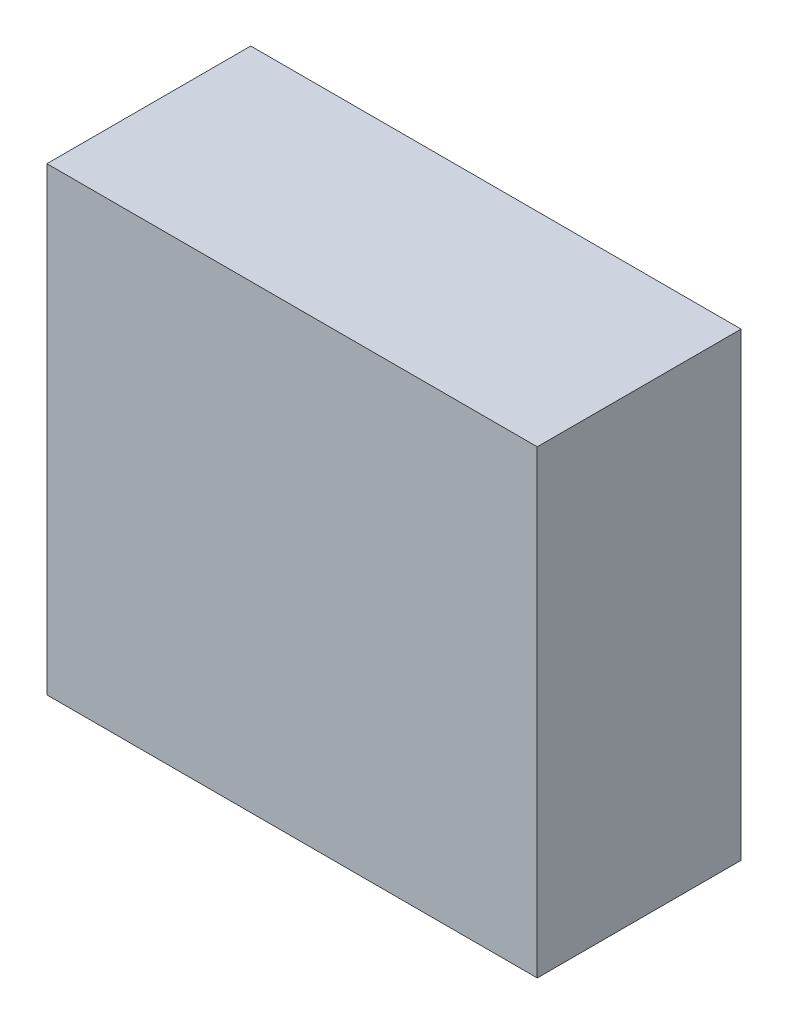
ISO-10303-21;
HEADER;
FILE_DESCRIPTION(('STEP AP214'),'2;1');
FILE_NAME('part.step','',(''),(''),'','','');
FILE_SCHEMA(('AUTOMOTIVE_DESIGN { 1 0 10303 214 1 1 1 1 }'));
ENDSEC;
DATA;
#1=APPLICATION_CONTEXT('core data for automotive mechanical design processes');
#2=APPLICATION_PROTOCOL_DEFINITION('international standard','automotive_design',2000,#1);
#3=PRODUCT_CONTEXT('',#1,'mechanical');
#4=PRODUCT('Part','Part','',(#3));
#5=PRODUCT_RELATED_PRODUCT_CATEGORY('part','',(#4));
#6=PRODUCT_DEFINITION_FORMATION('','',#4);
#7=PRODUCT_DEFINITION_CONTEXT('part definition',#1,'design');
#8=PRODUCT_DEFINITION('design','',#6,#7);
#9=PRODUCT_DEFINITION_SHAPE('','',#8);
#10=(LENGTH_UNIT() NAMED_UNIT(*) SI_UNIT(.MILLI.,.METRE.));
#11=(NAMED_UNIT(*) PLANE_ANGLE_UNIT() SI_UNIT($,.RADIAN.));
#12=(NAMED_UNIT(*) SI_UNIT($,.STERADIAN.) SOLID_ANGLE_UNIT());
#13=UNCERTAINTY_MEASURE_WITH_UNIT(LENGTH_MEASURE(1.E-05),#10,'distance_accuracy_value','');
#14=(GEOMETRIC_REPRESENTATION_CONTEXT(3) GLOBAL_UNCERTAINTY_ASSIGNED_CONTEXT((#13)) GLOBAL_UNIT_ASSIGNED_CONTEXT((#10,
#11,#12)) REPRESENTATION_CONTEXT('',''));
#15=CARTESIAN_POINT('',(0.,0.,0.));
#16=DIRECTION('',(0.,0.,1.));
#17=DIRECTION('',(1.,0.,0.));
#18=AXIS2_PLACEMENT_3D('',#15,#16,#17);
#19=CARTESIAN_POINT('',(0.,0.,74.));
#20=DIRECTION('',(1.,0.,0.));
#21=DIRECTION('',(0.,0.,-1.));
#22=AXIS2_PLACEMENT_3D('',#19,#20,#21);
#23=PLANE('',#22);
#24=DIRECTION('',(0.,-1.,0.));
#25=VECTOR('',#24,1.);
#26=CARTESIAN_POINT('',(0.,0.,0.));
#27=LINE('',#26,#25);
#28=CARTESIAN_POINT('',(0.,167.,0.));
#29=VERTEX_POINT('',#28);
#30=CARTESIAN_POINT('',(0.,0.,0.));
#31=VERTEX_POINT('',#30);
#32=EDGE_CURVE('E102',#29,#31,#27,.T.);
#33=ORIENTED_EDGE('',*,*,#32,.T.);
#34=DIRECTION('',(0.,0.,-1.));
#35=VECTOR('',#34,1.);
#36=CARTESIAN_POINT('',(0.,0.,74.));
#37=LINE('',#36,#35);
#38=CARTESIAN_POINT('',(0.,0.,74.));
#39=VERTEX_POINT('',#38);
#40=EDGE_CURVE('E11',#39,#31,#37,.T.);
#41=ORIENTED_EDGE('',*,*,#40,.F.);
#42=DIRECTION('',(0.,-1.,0.));
#43=VECTOR('',#42,1.);
#44=CARTESIAN_POINT('',(0.,0.,74.));
#45=LINE('',#44,#43);
#46=CARTESIAN_POINT('',(0.,167.,74.));
#47=VERTEX_POINT('',#46);
#48=EDGE_CURVE('E90',#47,#39,#45,.T.);
#49=ORIENTED_EDGE('',*,*,#48,.F.);
#50=DIRECTION('',(0.,0.,-1.));
#51=VECTOR('',#50,1.);
#52=CARTESIAN_POINT('',(0.,167.,74.));
#53=LINE('',#52,#51);
#54=EDGE_CURVE('E98',#47,#29,#53,.T.);
#55=ORIENTED_EDGE('',*,*,#54,.T.);
#56=EDGE_LOOP('',(#33,#41,#49,#55));
#57=FACE_BOUND('',#56,.T.);
#58=ADVANCED_FACE('F39',(#57),#23,.F.);
#59=CARTESIAN_POINT('',(0.,0.,74.));
#60=DIRECTION('',(0.,1.,0.));
#61=DIRECTION('',(0.,0.,1.));
#62=AXIS2_PLACEMENT_3D('',#59,#60,#61);
#63=PLANE('',#62);
#64=DIRECTION('',(1.,0.,0.));
#65=VECTOR('',#64,1.);
#66=CARTESIAN_POINT('',(0.,0.,0.));
#67=LINE('',#66,#65);
#68=CARTESIAN_POINT('',(178.,0.,0.));
#69=VERTEX_POINT('',#68);
#70=EDGE_CURVE('E94',#31,#69,#67,.T.);
#71=ORIENTED_EDGE('',*,*,#70,.T.);
#72=DIRECTION('',(0.,0.,-1.));
#73=VECTOR('',#72,1.);
#74=CARTESIAN_POINT('',(178.,0.,74.));
#75=LINE('',#74,#73);
#76=CARTESIAN_POINT('',(178.,0.,74.));
#77=VERTEX_POINT('',#76);
#78=EDGE_CURVE('E47',#77,#69,#75,.T.);
#79=ORIENTED_EDGE('',*,*,#78,.F.);
#80=DIRECTION('',(1.,0.,0.));
#81=VECTOR('',#80,1.);
#82=CARTESIAN_POINT('',(0.,0.,74.));
#83=LINE('',#82,#81);
#84=EDGE_CURVE('E85',#39,#77,#83,.T.);
#85=ORIENTED_EDGE('',*,*,#84,.F.);
#86=ORIENTED_EDGE('',*,*,#40,.T.);
#87=EDGE_LOOP('',(#71,#79,#85,#86));
#88=FACE_BOUND('',#87,.T.);
#89=ADVANCED_FACE('F93',(#88),#63,.F.);
#90=CARTESIAN_POINT('',(178.,0.,74.));
#91=DIRECTION('',(-1.,0.,0.));
#92=DIRECTION('',(0.,0.,1.));
#93=AXIS2_PLACEMENT_3D('',#90,#91,#92);
#94=PLANE('',#93);
#95=DIRECTION('',(0.,1.,0.));
#96=VECTOR('',#95,1.);
#97=CARTESIAN_POINT('',(178.,0.,0.));
#98=LINE('',#97,#96);
#99=CARTESIAN_POINT('',(178.,167.,0.));
#100=VERTEX_POINT('',#99);
#101=EDGE_CURVE('E72',#69,#100,#98,.T.);
#102=ORIENTED_EDGE('',*,*,#101,.T.);
#103=DIRECTION('',(0.,0.,-1.));
#104=VECTOR('',#103,1.);
#105=CARTESIAN_POINT('',(178.,167.,74.));
#106=LINE('',#105,#104);
#107=CARTESIAN_POINT('',(178.,167.,74.));
#108=VERTEX_POINT('',#107);
#109=EDGE_CURVE('E95',#108,#100,#106,.T.);
#110=ORIENTED_EDGE('',*,*,#109,.F.);
#111=DIRECTION('',(0.,1.,0.));
#112=VECTOR('',#111,1.);
#113=CARTESIAN_POINT('',(178.,0.,74.));
#114=LINE('',#113,#112);
#115=EDGE_CURVE('E88',#77,#108,#114,.T.);
#116=ORIENTED_EDGE('',*,*,#115,.F.);
#117=ORIENTED_EDGE('',*,*,#78,.T.);
#118=EDGE_LOOP('',(#102,#110,#116,#117));
#119=FACE_BOUND('',#118,.T.);
#120=ADVANCED_FACE('F96',(#119),#94,.F.);
#121=CARTESIAN_POINT('',(0.,167.,74.));
#122=DIRECTION('',(0.,-1.,0.));
#123=DIRECTION('',(0.,0.,-1.));
#124=AXIS2_PLACEMENT_3D('',#121,#122,#123);
#125=PLANE('',#124);
#126=DIRECTION('',(-1.,0.,0.));
#127=VECTOR('',#126,1.);
#128=CARTESIAN_POINT('',(0.,167.,0.));
#129=LINE('',#128,#127);
#130=EDGE_CURVE('E78',#100,#29,#129,.T.);
#131=ORIENTED_EDGE('',*,*,#130,.T.);
#132=ORIENTED_EDGE('',*,*,#54,.F.);
#133=DIRECTION('',(-1.,0.,0.));
#134=VECTOR('',#133,1.);
#135=CARTESIAN_POINT('',(0.,167.,74.));
#136=LINE('',#135,#134);
#137=EDGE_CURVE('E55',#108,#47,#136,.T.);
#138=ORIENTED_EDGE('',*,*,#137,.F.);
#139=ORIENTED_EDGE('',*,*,#109,.T.);
#140=EDGE_LOOP('',(#131,#132,#138,#139));
#141=FACE_BOUND('',#140,.T.);
#142=ADVANCED_FACE('F109',(#141),#125,.F.);
#143=CARTESIAN_POINT('',(0.,0.,74.));
#144=DIRECTION('',(0.,0.,-1.));
#145=DIRECTION('',(-1.,0.,0.));
#146=AXIS2_PLACEMENT_3D('',#143,#144,#145);
#147=PLANE('',#146);
#148=ORIENTED_EDGE('',*,*,#48,.T.);
#149=ORIENTED_EDGE('',*,*,#84,.T.);
#150=ORIENTED_EDGE('',*,*,#115,.T.);
#151=ORIENTED_EDGE('',*,*,#137,.T.);
#152=EDGE_LOOP('',(#148,#149,#150,#151));
#153=FACE_BOUND('',#152,.T.);
#154=ADVANCED_FACE('F86',(#153),#147,.F.);
#155=CARTESIAN_POINT('',(0.,0.,0.));
#156=DIRECTION('',(0.,0.,-1.));
#157=DIRECTION('',(-1.,0.,0.));
#158=AXIS2_PLACEMENT_3D('',#155,#156,#157);
#159=PLANE('',#158);
#160=ORIENTED_EDGE('',*,*,#32,.F.);
#161=ORIENTED_EDGE('',*,*,#130,.F.);
#162=ORIENTED_EDGE('',*,*,#101,.F.);
#163=ORIENTED_EDGE('',*,*,#70,.F.);
#164=EDGE_LOOP('',(#160,#161,#162,#163));
#165=FACE_BOUND('',#164,.T.);
#166=ADVANCED_FACE('F112',(#165),#159,.T.);
#167=CLOSED_SHELL('',(#58,#89,#120,#142,#154,#166));
#168=MANIFOLD_SOLID_BREP('B2',#167);
#169=ADVANCED_BREP_SHAPE_REPRESENTATION('',(#18,#168),#14);
#170=SHAPE_DEFINITION_REPRESENTATION(#9,#169);
ENDSEC;
END-ISO-10303-21;
